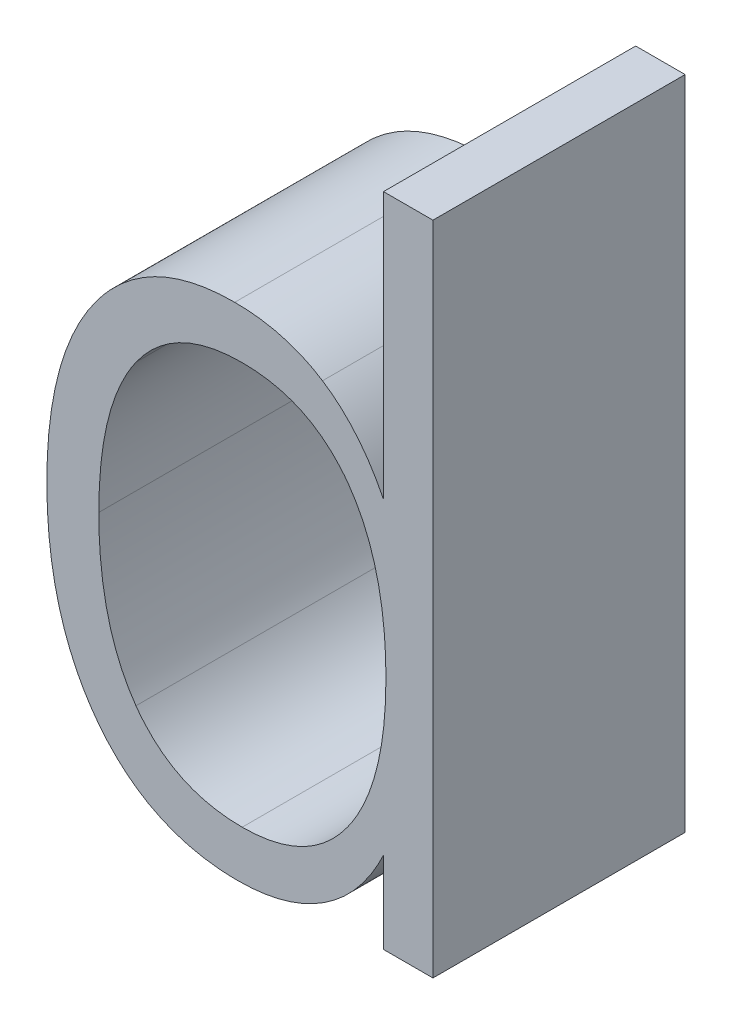
ISO-10303-21;
HEADER;
FILE_DESCRIPTION(('STEP AP214'),'2;1');
FILE_NAME('part.step','',(''),(''),'','','');
FILE_SCHEMA(('AUTOMOTIVE_DESIGN { 1 0 10303 214 1 1 1 1 }'));
ENDSEC;
DATA;
#1=APPLICATION_CONTEXT('core data for automotive mechanical design processes');
#2=APPLICATION_PROTOCOL_DEFINITION('international standard','automotive_design',2000,#1);
#3=PRODUCT_CONTEXT('',#1,'mechanical');
#4=PRODUCT('Part','Part','',(#3));
#5=PRODUCT_RELATED_PRODUCT_CATEGORY('part','',(#4));
#6=PRODUCT_DEFINITION_FORMATION('','',#4);
#7=PRODUCT_DEFINITION_CONTEXT('part definition',#1,'design');
#8=PRODUCT_DEFINITION('design','',#6,#7);
#9=PRODUCT_DEFINITION_SHAPE('','',#8);
#10=(LENGTH_UNIT() NAMED_UNIT(*) SI_UNIT(.MILLI.,.METRE.));
#11=(NAMED_UNIT(*) PLANE_ANGLE_UNIT() SI_UNIT($,.RADIAN.));
#12=(NAMED_UNIT(*) SI_UNIT($,.STERADIAN.) SOLID_ANGLE_UNIT());
#13=UNCERTAINTY_MEASURE_WITH_UNIT(LENGTH_MEASURE(1.E-05),#10,'distance_accuracy_value','');
#14=(GEOMETRIC_REPRESENTATION_CONTEXT(3) GLOBAL_UNCERTAINTY_ASSIGNED_CONTEXT((#13)) GLOBAL_UNIT_ASSIGNED_CONTEXT((#10,
#11,#12)) REPRESENTATION_CONTEXT('',''));
#15=CARTESIAN_POINT('',(0.,0.,0.));
#16=DIRECTION('',(0.,0.,1.));
#17=DIRECTION('',(1.,0.,0.));
#18=AXIS2_PLACEMENT_3D('',#15,#16,#17);
#19=CARTESIAN_POINT('',(-4.01548304044593,-5.20085865838051,-6.5));
#20=CARTESIAN_POINT('',(-4.01523138312723,-5.57735050779524,-6.5));
#21=CARTESIAN_POINT('',(-4.16731959833573,-5.78899684541117,-6.5));
#22=CARTESIAN_POINT('',(-4.01548304044593,-5.20085865838051,-5.5));
#23=CARTESIAN_POINT('',(-4.01523138312723,-5.57735050779524,-5.5));
#24=CARTESIAN_POINT('',(-4.16731959833573,-5.78899684541117,-5.50000000000001));
#25=(BOUNDED_SURFACE() B_SPLINE_SURFACE(1,2,((#19,#20,#21),(#22,#23,#24)),.UNSPECIFIED.,.F.,.F.,
.F.) B_SPLINE_SURFACE_WITH_KNOTS((2,2),(3,3),(-0.000531870954245445,-1.02265138938844E-06),
(5878.39466256072,5910.54595829486),
.UNSPECIFIED.) GEOMETRIC_REPRESENTATION_ITEM() RATIONAL_B_SPLINE_SURFACE(((0.992252686724051,
0.995349790952918,0.998516052379204),(0.992252686724051,0.995349790952918,0.998516052379204))) REPRESENTATION_ITEM('') SURFACE());
#26=DIRECTION('',(0.,0.,1.));
#27=VECTOR('',#26,1.);
#28=CARTESIAN_POINT('',(-4.015482624746,-5.202102016968,-6.5));
#29=LINE('',#28,#27);
#30=CARTESIAN_POINT('',(-4.015482624746,-5.202102016968,-6.5));
#31=VERTEX_POINT('',#30);
#32=CARTESIAN_POINT('',(-4.015482624746,-5.202102016968,-5.5));
#33=VERTEX_POINT('',#32);
#34=EDGE_CURVE('E211',#31,#33,#29,.T.);
#35=CARTESIAN_POINT('',(-1282.50872396695,1377.86818639547,-6.50000000000016));
#36=DIRECTION('',(0.,0.,-1.));
#37=DIRECTION('',(0.678554519954221,-0.734550041487778,0.));
#38=AXIS2_PLACEMENT_3D('',#35,#36,#37);
#39=ELLIPSE('',#38,1883.80194796684,33.0787545697085);
#40=CARTESIAN_POINT('',(-4.166736802523,-5.78818443919,-6.5));
#41=VERTEX_POINT('',#40);
#42=EDGE_CURVE('E252',#31,#41,#39,.T.);
#43=DIRECTION('',(0.,0.,1.));
#44=VECTOR('',#43,1.);
#45=CARTESIAN_POINT('',(-4.166736802523,-5.78818443919,-6.5));
#46=LINE('',#45,#44);
#47=CARTESIAN_POINT('',(-4.166736802523,-5.78818443919,-5.5));
#48=VERTEX_POINT('',#47);
#49=EDGE_CURVE('E11',#41,#48,#46,.T.);
#50=CARTESIAN_POINT('',(-1282.50872396695,1377.86818639547,-5.50000000000016));
#51=DIRECTION('',(0.,0.,-1.));
#52=DIRECTION('',(0.678554519954221,-0.734550041487778,0.));
#53=AXIS2_PLACEMENT_3D('',#50,#51,#52);
#54=ELLIPSE('',#53,1883.80194796684,33.0787545697085);
#55=EDGE_CURVE('E324',#33,#48,#54,.T.);
#56=ORIENTED_EDGE('',*,*,#34,.F.);
#57=ORIENTED_EDGE('',*,*,#42,.T.);
#58=ORIENTED_EDGE('',*,*,#49,.T.);
#59=ORIENTED_EDGE('',*,*,#55,.F.);
#60=EDGE_LOOP('',(#56,#57,#58,#59));
#61=FACE_BOUND('',#60,.T.);
#62=ADVANCED_FACE('F16',(#61),#25,.F.);
#63=CARTESIAN_POINT('',(-4.16608661975848,-5.78727566787338,-6.5));
#64=CARTESIAN_POINT('',(-4.23587521471325,-5.88500699006786,-6.49999999999999));
#65=CARTESIAN_POINT('',(-4.3307379461551,-5.9376015683592,-6.5));
#66=CARTESIAN_POINT('',(-4.44161468803858,-5.99907476645338,-6.5));
#67=CARTESIAN_POINT('',(-4.58663214113982,-5.99882847888092,-6.50000000000001));
#68=CARTESIAN_POINT('',(-4.16608661975848,-5.78727566787338,-5.5));
#69=CARTESIAN_POINT('',(-4.23587521471325,-5.88500699006786,-5.50000000000001));
#70=CARTESIAN_POINT('',(-4.3307379461551,-5.9376015683592,-5.5));
#71=CARTESIAN_POINT('',(-4.44161468803858,-5.99907476645338,-5.5));
#72=CARTESIAN_POINT('',(-4.58663214113982,-5.99882847888092,-5.5));
#73=(BOUNDED_SURFACE() B_SPLINE_SURFACE(1,2,((#63,#64,#65,#66,#67),(#68,#69,#70,#71,#72)),
.UNSPECIFIED.,.F.,.F.,.F.) B_SPLINE_SURFACE_WITH_KNOTS((2,2),(3,2,3),(-0.0076759980724137,
-1.63390557035084E-05),(406.092742618875,410.147846886676,414.882873821805),
.UNSPECIFIED.) GEOMETRIC_REPRESENTATION_ITEM() RATIONAL_B_SPLINE_SURFACE(((0.988645783398383,
0.99420836875953,1.,0.993237281186648,0.986786856156905),(0.988645783398383,0.99420836875953,1.,
0.993237281186648,0.986786856156905))) REPRESENTATION_ITEM('') SURFACE());
#74=CARTESIAN_POINT('',(-67.636341728998,108.244200299651,-6.5));
#75=DIRECTION('',(0.,0.,-1.));
#76=DIRECTION('',(0.484889288501053,-0.874575541561129,0.));
#77=AXIS2_PLACEMENT_3D('',#74,#75,#76);
#78=ELLIPSE('',#77,130.556820381336,7.7126504273919);
#79=CARTESIAN_POINT('',(-4.585475558079,-5.998829461412,-6.5));
#80=VERTEX_POINT('',#79);
#81=EDGE_CURVE('E194',#41,#80,#78,.T.);
#82=DIRECTION('',(0.,0.,1.));
#83=VECTOR('',#82,1.);
#84=CARTESIAN_POINT('',(-4.585475558079,-5.998829461412,-6.5));
#85=LINE('',#84,#83);
#86=CARTESIAN_POINT('',(-4.585475558079,-5.998829461412,-5.5));
#87=VERTEX_POINT('',#86);
#88=EDGE_CURVE('E29',#80,#87,#85,.T.);
#89=CARTESIAN_POINT('',(-67.636341728998,108.244200299651,-5.5));
#90=DIRECTION('',(0.,0.,-1.));
#91=DIRECTION('',(0.484889288501053,-0.874575541561129,0.));
#92=AXIS2_PLACEMENT_3D('',#89,#90,#91);
#93=ELLIPSE('',#92,130.556820381336,7.7126504273919);
#94=EDGE_CURVE('E328',#48,#87,#93,.T.);
#95=ORIENTED_EDGE('',*,*,#49,.F.);
#96=ORIENTED_EDGE('',*,*,#81,.T.);
#97=ORIENTED_EDGE('',*,*,#88,.T.);
#98=ORIENTED_EDGE('',*,*,#94,.F.);
#99=EDGE_LOOP('',(#95,#96,#97,#98));
#100=FACE_BOUND('',#99,.T.);
#101=ADVANCED_FACE('F18',(#100),#73,.F.);
#102=CARTESIAN_POINT('',(-4.58430355172886,-5.99882851911392,-6.50000000000001));
#103=CARTESIAN_POINT('',(-4.74752745931366,-5.99909085548459,-6.5));
#104=CARTESIAN_POINT('',(-4.8658298944141,-5.92631941079016,-6.5));
#105=CARTESIAN_POINT('',(-4.94723526236849,-5.87624448015247,-6.5));
#106=CARTESIAN_POINT('',(-5.00736801689359,-5.79158930997974,-6.5));
#107=CARTESIAN_POINT('',(-4.58430355172886,-5.99882851911392,-5.50000000000001));
#108=CARTESIAN_POINT('',(-4.74752745931366,-5.99909085548459,-5.5));
#109=CARTESIAN_POINT('',(-4.8658298944141,-5.92631941079016,-5.5));
#110=CARTESIAN_POINT('',(-4.94723526236849,-5.87624448015247,-5.5));
#111=CARTESIAN_POINT('',(-5.00736801689359,-5.79158930997974,-5.5));
#112=(BOUNDED_SURFACE() B_SPLINE_SURFACE(1,2,((#102,#103,#104,#105,#106),(#107,#108,#109,#110,
#111)),.UNSPECIFIED.,.F.,.F.,.F.) B_SPLINE_SURFACE_WITH_KNOTS((2,2),(3,2,3),
(-0.000275164440554266,-5.85322672658282E-07),(11413.7656468567,11441.4842535272,
11460.5662153827),
.UNSPECIFIED.) GEOMETRIC_REPRESENTATION_ITEM() RATIONAL_B_SPLINE_SURFACE(((0.997175452105519,
0.998580849870725,1.,0.99902303283293,0.9980525831595),(0.997175452105519,0.998580849870725,1.,
0.99902303283293,0.9980525831595))) REPRESENTATION_ITEM('') SURFACE());
#113=CARTESIAN_POINT('',(1903.26270009148,3096.06312561209,-6.49999999999977));
#114=DIRECTION('',(0.,0.,-1.));
#115=DIRECTION('',(-0.523940467335907,-0.851754886506577,0.));
#116=AXIS2_PLACEMENT_3D('',#113,#114,#115);
#117=ELLIPSE('',#116,3641.88042142783,40.481337390312);
#118=CARTESIAN_POINT('',(-5.006740202523,-5.792471394746,-6.5));
#119=VERTEX_POINT('',#118);
#120=EDGE_CURVE('E188',#80,#119,#117,.T.);
#121=DIRECTION('',(0.,0.,1.));
#122=VECTOR('',#121,1.);
#123=CARTESIAN_POINT('',(-5.006740202523,-5.792471394746,-6.5));
#124=LINE('',#123,#122);
#125=CARTESIAN_POINT('',(-5.006740202523,-5.792471394746,-5.5));
#126=VERTEX_POINT('',#125);
#127=EDGE_CURVE('E172',#119,#126,#124,.T.);
#128=CARTESIAN_POINT('',(1903.26270009148,3096.06312561209,-5.49999999999977));
#129=DIRECTION('',(0.,0.,-1.));
#130=DIRECTION('',(-0.523940467335907,-0.851754886506577,0.));
#131=AXIS2_PLACEMENT_3D('',#128,#129,#130);
#132=ELLIPSE('',#131,3641.88042142783,40.481337390312);
#133=EDGE_CURVE('E337',#87,#126,#132,.T.);
#134=ORIENTED_EDGE('',*,*,#88,.F.);
#135=ORIENTED_EDGE('',*,*,#120,.T.);
#136=ORIENTED_EDGE('',*,*,#127,.T.);
#137=ORIENTED_EDGE('',*,*,#133,.F.);
#138=EDGE_LOOP('',(#134,#135,#136,#137));
#139=FACE_BOUND('',#138,.T.);
#140=ADVANCED_FACE('F189',(#139),#112,.F.);
#141=CARTESIAN_POINT('',(-5.00615960424775,-5.79328526231746,-6.5));
#142=CARTESIAN_POINT('',(-5.1542078228253,-5.58613425978978,-6.5));
#143=CARTESIAN_POINT('',(-5.1540147960494,-5.20110169940371,-6.5));
#144=CARTESIAN_POINT('',(-5.00615960424775,-5.79328526231746,-5.5));
#145=CARTESIAN_POINT('',(-5.1542078228253,-5.58613425978978,-5.5));
#146=CARTESIAN_POINT('',(-5.1540147960494,-5.20110169940371,-5.5));
#147=(BOUNDED_SURFACE() B_SPLINE_SURFACE(1,2,((#141,#142,#143),(#144,#145,#146)),.UNSPECIFIED.,
.F.,.F.,.F.) B_SPLINE_SURFACE_WITH_KNOTS((2,2),(3,3),(-0.0146193626605001,
-2.87975745341014E-05),(217.082443067193,223.189260954368),
.UNSPECIFIED.) GEOMETRIC_REPRESENTATION_ITEM() RATIONAL_B_SPLINE_SURFACE(((0.990550005851137,
0.974480897501296,0.960296625814557),(0.990550005851137,0.974480897501296,0.960296625814557))) REPRESENTATION_ITEM('') SURFACE());
#148=CARTESIAN_POINT('',(38.6696992130983,47.000244300287,-6.5));
#149=DIRECTION('',(0.,0.,-1.));
#150=DIRECTION('',(-0.635867004474895,-0.771798647718512,0.));
#151=AXIS2_PLACEMENT_3D('',#148,#149,#150);
#152=ELLIPSE('',#151,68.5366245675646,5.97782293016551);
#153=CARTESIAN_POINT('',(-5.154015046968,-5.202102016968,-6.5));
#154=VERTEX_POINT('',#153);
#155=EDGE_CURVE('E177',#119,#154,#152,.T.);
#156=DIRECTION('',(0.,0.,1.));
#157=VECTOR('',#156,1.);
#158=CARTESIAN_POINT('',(-5.154015046968,-5.202102016968,-6.5));
#159=LINE('',#158,#157);
#160=CARTESIAN_POINT('',(-5.154015046968,-5.202102016968,-5.5));
#161=VERTEX_POINT('',#160);
#162=EDGE_CURVE('E185',#154,#161,#159,.T.);
#163=CARTESIAN_POINT('',(38.6696992130983,47.000244300287,-5.5));
#164=DIRECTION('',(0.,0.,-1.));
#165=DIRECTION('',(-0.635867004474895,-0.771798647718512,0.));
#166=AXIS2_PLACEMENT_3D('',#163,#164,#165);
#167=ELLIPSE('',#166,68.5366245675646,5.97782293016551);
#168=EDGE_CURVE('E180',#126,#161,#167,.T.);
#169=ORIENTED_EDGE('',*,*,#127,.F.);
#170=ORIENTED_EDGE('',*,*,#155,.T.);
#171=ORIENTED_EDGE('',*,*,#162,.T.);
#172=ORIENTED_EDGE('',*,*,#168,.F.);
#173=EDGE_LOOP('',(#169,#170,#171,#172));
#174=FACE_BOUND('',#173,.T.);
#175=ADVANCED_FACE('F174',(#174),#147,.F.);
#176=CARTESIAN_POINT('',(-5.154015046968,-5.202102016968,-5.49804208681511));
#177=CARTESIAN_POINT('',(-5.154015046968,-5.202102016968,-6.50195791318489));
#178=CARTESIAN_POINT('',(-5.154015046968,-4.94692232807889,-5.49804208681511));
#179=CARTESIAN_POINT('',(-5.154015046968,-4.94692232807889,-6.50195791318489));
#180=CARTESIAN_POINT('',(-5.104445535857,-4.750334794746,-5.49804208681511));
#181=CARTESIAN_POINT('',(-5.104445535857,-4.750334794746,-6.50195791318489));
#182=CARTESIAN_POINT('',(-5.005814513635,-4.611566128079,-5.49804208681511));
#183=CARTESIAN_POINT('',(-5.005814513635,-4.611566128079,-6.50195791318489));
#184=(BOUNDED_SURFACE() B_SPLINE_SURFACE(3,1,((#176,#177),(#178,#179),(#180,#181),(#182,#183)),
.UNSPECIFIED.,.F.,.F.,.F.) B_SPLINE_SURFACE_WITH_KNOTS((4,4),(2,2),(0.,1.),(-1.00195791318489,
0.00195791318489261),
.UNSPECIFIED.) GEOMETRIC_REPRESENTATION_ITEM() RATIONAL_B_SPLINE_SURFACE(((1.,1.),(1.,1.),(1.,
1.),(1.,1.))) REPRESENTATION_ITEM('') SURFACE());
#185=CARTESIAN_POINT('',(-5.154015046968,-5.202102016968,-6.5));
#186=CARTESIAN_POINT('',(-5.154015046968,-4.94692232807889,-6.5));
#187=CARTESIAN_POINT('',(-5.104445535857,-4.750334794746,-6.5));
#188=CARTESIAN_POINT('',(-5.005814513635,-4.611566128079,-6.5));
#189=(BOUNDED_CURVE() B_SPLINE_CURVE(3,(#185,#186,#187,#188),.UNSPECIFIED.,.F.,
.F.) B_SPLINE_CURVE_WITH_KNOTS((4,4),(0.,1.),
.UNSPECIFIED.) CURVE() GEOMETRIC_REPRESENTATION_ITEM() RATIONAL_B_SPLINE_CURVE((1.,1.,1.,1.)) REPRESENTATION_ITEM(''));
#190=CARTESIAN_POINT('',(-5.005814513635,-4.611566128079,-6.5));
#191=VERTEX_POINT('',#190);
#192=EDGE_CURVE('E201',#154,#191,#189,.T.);
#193=DIRECTION('',(0.,0.,1.));
#194=VECTOR('',#193,1.);
#195=CARTESIAN_POINT('',(-5.005814513635,-4.611566128079,-6.5));
#196=LINE('',#195,#194);
#197=CARTESIAN_POINT('',(-5.005814513635,-4.611566128079,-5.5));
#198=VERTEX_POINT('',#197);
#199=EDGE_CURVE('E288',#191,#198,#196,.T.);
#200=CARTESIAN_POINT('',(-5.154015046968,-5.202102016968,-5.5));
#201=CARTESIAN_POINT('',(-5.154015046968,-4.94692232807889,-5.5));
#202=CARTESIAN_POINT('',(-5.104445535857,-4.750334794746,-5.5));
#203=CARTESIAN_POINT('',(-5.005814513635,-4.611566128079,-5.5));
#204=(BOUNDED_CURVE() B_SPLINE_CURVE(3,(#200,#201,#202,#203),.UNSPECIFIED.,.F.,
.F.) B_SPLINE_CURVE_WITH_KNOTS((4,4),(0.,1.),
.UNSPECIFIED.) CURVE() GEOMETRIC_REPRESENTATION_ITEM() RATIONAL_B_SPLINE_CURVE((1.,1.,1.,1.)) REPRESENTATION_ITEM(''));
#205=EDGE_CURVE('E223',#161,#198,#204,.T.);
#206=ORIENTED_EDGE('',*,*,#162,.F.);
#207=ORIENTED_EDGE('',*,*,#192,.T.);
#208=ORIENTED_EDGE('',*,*,#199,.T.);
#209=ORIENTED_EDGE('',*,*,#205,.F.);
#210=EDGE_LOOP('',(#206,#207,#208,#209));
#211=FACE_BOUND('',#210,.T.);
#212=ADVANCED_FACE('F483',(#211),#184,.F.);
#213=CARTESIAN_POINT('',(-5.00645192637761,-4.61246255182292,-6.5));
#214=CARTESIAN_POINT('',(-4.94318164353439,-4.52330664374334,-6.5));
#215=CARTESIAN_POINT('',(-4.85724276799174,-4.47216449720199,-6.5));
#216=CARTESIAN_POINT('',(-4.74131704582077,-4.40317720555146,-6.5));
#217=CARTESIAN_POINT('',(-4.58429709329111,-4.40343667776477,-6.5));
#218=CARTESIAN_POINT('',(-5.00645192637761,-4.61246255182292,-5.50000000000001));
#219=CARTESIAN_POINT('',(-4.94318164353439,-4.52330664374334,-5.49999999999999));
#220=CARTESIAN_POINT('',(-4.85724276799174,-4.47216449720199,-5.5));
#221=CARTESIAN_POINT('',(-4.74131704582077,-4.40317720555146,-5.5));
#222=CARTESIAN_POINT('',(-4.58429709329111,-4.40343667776477,-5.5));
#223=(BOUNDED_SURFACE() B_SPLINE_SURFACE(1,2,((#213,#214,#215,#216,#217),(#218,#219,#220,#221,
#222)),.UNSPECIFIED.,.F.,.F.,.F.) B_SPLINE_SURFACE_WITH_KNOTS((2,2),(3,2,3),
(-0.00907406478935875,-1.93022431563862E-05),(690.456509755272,693.9094509789,698.557779111802),
.UNSPECIFIED.) GEOMETRIC_REPRESENTATION_ITEM() RATIONAL_B_SPLINE_SURFACE(((0.988572422331226,
0.994170172676361,1.,0.992151922490601,0.984724423653819),(0.988572422331226,0.994170172676361,
1.,0.992151922490601,0.984724423653819))) REPRESENTATION_ITEM('') SURFACE());
#224=CARTESIAN_POINT('',(51.6207196785017,-99.3772851299836,-6.5));
#225=DIRECTION('',(0.,0.,-1.));
#226=DIRECTION('',(0.51139573188262,-0.859345335364218,0.));
#227=AXIS2_PLACEMENT_3D('',#224,#225,#226);
#228=ELLIPSE('',#227,110.438861658924,7.0640011504587);
#229=CARTESIAN_POINT('',(-4.585472735857,-4.403435705857,-6.5));
#230=VERTEX_POINT('',#229);
#231=EDGE_CURVE('E208',#191,#230,#228,.T.);
#232=DIRECTION('',(0.,0.,1.));
#233=VECTOR('',#232,1.);
#234=CARTESIAN_POINT('',(-4.585472735857,-4.403435705857,-6.5));
#235=LINE('',#234,#233);
#236=CARTESIAN_POINT('',(-4.585472735857,-4.403435705857,-5.5));
#237=VERTEX_POINT('',#236);
#238=EDGE_CURVE('E43',#230,#237,#235,.T.);
#239=CARTESIAN_POINT('',(51.6207196785017,-99.3772851299836,-5.5));
#240=DIRECTION('',(0.,0.,-1.));
#241=DIRECTION('',(0.51139573188262,-0.859345335364218,0.));
#242=AXIS2_PLACEMENT_3D('',#239,#240,#241);
#243=ELLIPSE('',#242,110.438861658924,7.0640011504587);
#244=EDGE_CURVE('E218',#198,#237,#243,.T.);
#245=ORIENTED_EDGE('',*,*,#199,.F.);
#246=ORIENTED_EDGE('',*,*,#231,.T.);
#247=ORIENTED_EDGE('',*,*,#238,.T.);
#248=ORIENTED_EDGE('',*,*,#244,.F.);
#249=EDGE_LOOP('',(#245,#246,#247,#248));
#250=FACE_BOUND('',#249,.T.);
#251=ADVANCED_FACE('F476',(#250),#223,.F.);
#252=CARTESIAN_POINT('',(-4.585472735857,-4.403435705857,-5.49787270727539));
#253=CARTESIAN_POINT('',(-4.585472735857,-4.403435705857,-6.50212729272461));
#254=CARTESIAN_POINT('',(-4.402945513635,-4.403435705857,-5.49787270727539));
#255=CARTESIAN_POINT('',(-4.402945513635,-4.403435705857,-6.50212729272461));
#256=CARTESIAN_POINT('',(-4.262308535857,-4.472523705857,-5.49787270727539));
#257=CARTESIAN_POINT('',(-4.262308535857,-4.472523705857,-6.50212729272461));
#258=CARTESIAN_POINT('',(-4.163542046968,-4.610688416968,-5.49787270727539));
#259=CARTESIAN_POINT('',(-4.163542046968,-4.610688416968,-6.50212729272461));
#260=(BOUNDED_SURFACE() B_SPLINE_SURFACE(3,1,((#252,#253),(#254,#255),(#256,#257),(#258,#259)),
.UNSPECIFIED.,.F.,.F.,.F.) B_SPLINE_SURFACE_WITH_KNOTS((4,4),(2,2),(0.,1.),(-1.00212729272461,
0.00212729272461332),
.UNSPECIFIED.) GEOMETRIC_REPRESENTATION_ITEM() RATIONAL_B_SPLINE_SURFACE(((1.,1.),(1.,1.),(1.,
1.),(1.,1.))) REPRESENTATION_ITEM('') SURFACE());
#261=CARTESIAN_POINT('',(-4.585472735857,-4.403435705857,-6.5));
#262=CARTESIAN_POINT('',(-4.402945513635,-4.403435705857,-6.5));
#263=CARTESIAN_POINT('',(-4.262308535857,-4.472523705857,-6.5));
#264=CARTESIAN_POINT('',(-4.163542046968,-4.610688416968,-6.5));
#265=(BOUNDED_CURVE() B_SPLINE_CURVE(3,(#261,#262,#263,#264),.UNSPECIFIED.,.F.,
.F.) B_SPLINE_CURVE_WITH_KNOTS((4,4),(0.,1.),
.UNSPECIFIED.) CURVE() GEOMETRIC_REPRESENTATION_ITEM() RATIONAL_B_SPLINE_CURVE((1.,1.,1.,1.)) REPRESENTATION_ITEM(''));
#266=CARTESIAN_POINT('',(-4.163542046968,-4.610688416968,-6.5));
#267=VERTEX_POINT('',#266);
#268=EDGE_CURVE('E307',#230,#267,#265,.T.);
#269=DIRECTION('',(0.,0.,1.));
#270=VECTOR('',#269,1.);
#271=CARTESIAN_POINT('',(-4.163542046968,-4.610688416968,-6.5));
#272=LINE('',#271,#270);
#273=CARTESIAN_POINT('',(-4.163542046968,-4.610688416968,-5.5));
#274=VERTEX_POINT('',#273);
#275=EDGE_CURVE('E366',#267,#274,#272,.T.);
#276=CARTESIAN_POINT('',(-4.585472735857,-4.403435705857,-5.5));
#277=CARTESIAN_POINT('',(-4.402945513635,-4.403435705857,-5.5));
#278=CARTESIAN_POINT('',(-4.262308535857,-4.472523705857,-5.5));
#279=CARTESIAN_POINT('',(-4.163542046968,-4.610688416968,-5.5));
#280=(BOUNDED_CURVE() B_SPLINE_CURVE(3,(#276,#277,#278,#279),.UNSPECIFIED.,.F.,
.F.) B_SPLINE_CURVE_WITH_KNOTS((4,4),(0.,1.),
.UNSPECIFIED.) CURVE() GEOMETRIC_REPRESENTATION_ITEM() RATIONAL_B_SPLINE_CURVE((1.,1.,1.,1.)) REPRESENTATION_ITEM(''));
#281=EDGE_CURVE('E222',#237,#274,#280,.T.);
#282=ORIENTED_EDGE('',*,*,#238,.F.);
#283=ORIENTED_EDGE('',*,*,#268,.T.);
#284=ORIENTED_EDGE('',*,*,#275,.T.);
#285=ORIENTED_EDGE('',*,*,#281,.F.);
#286=EDGE_LOOP('',(#282,#283,#284,#285));
#287=FACE_BOUND('',#286,.T.);
#288=ADVANCED_FACE('F478',(#287),#260,.F.);
#289=CARTESIAN_POINT('',(-4.16412352107318,-4.60987517859366,-6.5));
#290=CARTESIAN_POINT('',(-4.01528893026234,-4.81765393365712,-6.5));
#291=CARTESIAN_POINT('',(-4.01548287652592,-5.2031023358901,-6.5));
#292=CARTESIAN_POINT('',(-4.16412352107318,-4.60987517859366,-5.50000000000001));
#293=CARTESIAN_POINT('',(-4.01528893026234,-4.81765393365712,-5.50000000000001));
#294=CARTESIAN_POINT('',(-4.01548287652592,-5.2031023358901,-5.50000000000001));
#295=(BOUNDED_SURFACE() B_SPLINE_SURFACE(1,2,((#289,#290,#291),(#292,#293,#294)),.UNSPECIFIED.,
.F.,.F.,.F.) B_SPLINE_SURFACE_WITH_KNOTS((2,2),(3,3),(-0.0213269388567497,
-4.17999819262334E-05),(1.45496702225575,6.49211185333003),
.UNSPECIFIED.) GEOMETRIC_REPRESENTATION_ITEM() RATIONAL_B_SPLINE_SURFACE(((0.988678573025146,
0.969475141017359,0.953000821335201),(0.988678573025146,0.969475141017359,0.953000821335201))) REPRESENTATION_ITEM('') SURFACE());
#296=CARTESIAN_POINT('',(-34.15522962294,-40.7500594527654,-6.5));
#297=DIRECTION('',(0.,0.,-1.));
#298=DIRECTION('',(-0.636319858389381,-0.77142532873851,0.));
#299=AXIS2_PLACEMENT_3D('',#296,#297,#298);
#300=ELLIPSE('',#299,46.9818608085529,4.96400063231897);
#301=EDGE_CURVE('E233',#267,#31,#300,.T.);
#302=CARTESIAN_POINT('',(-34.15522962294,-40.7500594527654,-5.5));
#303=DIRECTION('',(0.,0.,-1.));
#304=DIRECTION('',(-0.636319858389381,-0.77142532873851,0.));
#305=AXIS2_PLACEMENT_3D('',#302,#303,#304);
#306=ELLIPSE('',#305,46.9818608085529,4.96400063231897);
#307=EDGE_CURVE('E329',#274,#33,#306,.T.);
#308=ORIENTED_EDGE('',*,*,#275,.F.);
#309=ORIENTED_EDGE('',*,*,#301,.T.);
#310=ORIENTED_EDGE('',*,*,#34,.T.);
#311=ORIENTED_EDGE('',*,*,#307,.F.);
#312=EDGE_LOOP('',(#308,#309,#310,#311));
#313=FACE_BOUND('',#312,.T.);
#314=ADVANCED_FACE('F656',(#313),#295,.F.);
#315=CARTESIAN_POINT('',(-5.360014691412,-5.202102016968,-5.49850402368231));
#316=CARTESIAN_POINT('',(-5.360014691412,-5.202102016968,-6.50149597631769));
#317=CARTESIAN_POINT('',(-5.360014691412,-5.507723283634,-5.49850402368231));
#318=CARTESIAN_POINT('',(-5.360014691412,-5.507723283634,-6.50149597631769));
#319=CARTESIAN_POINT('',(-5.292267246968,-5.748693083634,-5.49850402368231));
#320=CARTESIAN_POINT('',(-5.292267246968,-5.748693083634,-6.50149597631769));
#321=CARTESIAN_POINT('',(-5.156800580301,-5.925604083634,-5.49850402368231));
#322=CARTESIAN_POINT('',(-5.156800580301,-5.925604083634,-6.50149597631769));
#323=(BOUNDED_SURFACE() B_SPLINE_SURFACE(3,1,((#315,#316),(#317,#318),(#319,#320),(#321,#322)),
.UNSPECIFIED.,.F.,.F.,.F.) B_SPLINE_SURFACE_WITH_KNOTS((4,4),(2,2),(0.,1.),(-1.00149597631769,
0.00149597631769287),
.UNSPECIFIED.) GEOMETRIC_REPRESENTATION_ITEM() RATIONAL_B_SPLINE_SURFACE(((1.,1.),(1.,1.),(1.,
1.),(1.,1.))) REPRESENTATION_ITEM('') SURFACE());
#324=DIRECTION('',(0.,0.,1.));
#325=VECTOR('',#324,1.);
#326=CARTESIAN_POINT('',(-5.360014691412,-5.202102016968,-6.5));
#327=LINE('',#326,#325);
#328=CARTESIAN_POINT('',(-5.360014691412,-5.202102016968,-6.5));
#329=VERTEX_POINT('',#328);
#330=CARTESIAN_POINT('',(-5.360014691412,-5.202102016968,-5.5));
#331=VERTEX_POINT('',#330);
#332=EDGE_CURVE('E276',#329,#331,#327,.T.);
#333=CARTESIAN_POINT('',(-5.360014691412,-5.202102016968,-6.5));
#334=CARTESIAN_POINT('',(-5.360014691412,-5.507723283634,-6.5));
#335=CARTESIAN_POINT('',(-5.292267246968,-5.748693083634,-6.5));
#336=CARTESIAN_POINT('',(-5.156800580301,-5.925604083634,-6.5));
#337=(BOUNDED_CURVE() B_SPLINE_CURVE(3,(#333,#334,#335,#336),.UNSPECIFIED.,.F.,
.F.) B_SPLINE_CURVE_WITH_KNOTS((4,4),(0.,1.),
.UNSPECIFIED.) CURVE() GEOMETRIC_REPRESENTATION_ITEM() RATIONAL_B_SPLINE_CURVE((1.,1.,1.,1.)) REPRESENTATION_ITEM(''));
#338=CARTESIAN_POINT('',(-5.156800580301,-5.925604083634,-6.5));
#339=VERTEX_POINT('',#338);
#340=EDGE_CURVE('E338',#329,#339,#337,.T.);
#341=DIRECTION('',(0.,0.,1.));
#342=VECTOR('',#341,1.);
#343=CARTESIAN_POINT('',(-5.156800580301,-5.925604083634,-6.5));
#344=LINE('',#343,#342);
#345=CARTESIAN_POINT('',(-5.156800580301,-5.925604083634,-5.5));
#346=VERTEX_POINT('',#345);
#347=EDGE_CURVE('E227',#339,#346,#344,.T.);
#348=CARTESIAN_POINT('',(-5.360014691412,-5.202102016968,-5.5));
#349=CARTESIAN_POINT('',(-5.360014691412,-5.507723283634,-5.5));
#350=CARTESIAN_POINT('',(-5.292267246968,-5.748693083634,-5.5));
#351=CARTESIAN_POINT('',(-5.156800580301,-5.925604083634,-5.5));
#352=(BOUNDED_CURVE() B_SPLINE_CURVE(3,(#348,#349,#350,#351),.UNSPECIFIED.,.F.,
.F.) B_SPLINE_CURVE_WITH_KNOTS((4,4),(0.,1.),
.UNSPECIFIED.) CURVE() GEOMETRIC_REPRESENTATION_ITEM() RATIONAL_B_SPLINE_CURVE((1.,1.,1.,1.)) REPRESENTATION_ITEM(''));
#353=EDGE_CURVE('E353',#331,#346,#352,.T.);
#354=ORIENTED_EDGE('',*,*,#332,.F.);
#355=ORIENTED_EDGE('',*,*,#340,.T.);
#356=ORIENTED_EDGE('',*,*,#347,.T.);
#357=ORIENTED_EDGE('',*,*,#353,.F.);
#358=EDGE_LOOP('',(#354,#355,#356,#357));
#359=FACE_BOUND('',#358,.T.);
#360=ADVANCED_FACE('F466',(#359),#323,.F.);
#361=CARTESIAN_POINT('',(-5.15951189538423,-4.4758598775147,-6.5));
#362=CARTESIAN_POINT('',(-5.36023264297963,-4.74172396833451,-6.5));
#363=CARTESIAN_POINT('',(-5.36001445484773,-5.20310226075456,-6.5));
#364=CARTESIAN_POINT('',(-5.15951189538423,-4.4758598775147,-5.50000000000001));
#365=CARTESIAN_POINT('',(-5.36023264297963,-4.74172396833451,-5.5));
#366=CARTESIAN_POINT('',(-5.36001445484773,-5.20310226075456,-5.5));
#367=(BOUNDED_SURFACE() B_SPLINE_SURFACE(1,2,((#361,#362,#363),(#364,#365,#366)),.UNSPECIFIED.,
.F.,.F.,.F.) B_SPLINE_SURFACE_WITH_KNOTS((2,2),(3,3),(-0.0106863216809216,
-1.60593213812971E-05),(295.657697529489,303.553883503893),
.UNSPECIFIED.) GEOMETRIC_REPRESENTATION_ITEM() RATIONAL_B_SPLINE_SURFACE(((0.995136178951472,
0.979689060521037,0.965927270304369),(0.995136178951472,0.979689060521037,0.965927270304369))) REPRESENTATION_ITEM('') SURFACE());
#368=DIRECTION('',(0.,0.,1.));
#369=VECTOR('',#368,1.);
#370=CARTESIAN_POINT('',(-5.16011386919,-4.476658261412,-6.5));
#371=LINE('',#370,#369);
#372=CARTESIAN_POINT('',(-5.16011386919,-4.476658261412,-6.5));
#373=VERTEX_POINT('',#372);
#374=CARTESIAN_POINT('',(-5.16011386919,-4.476658261412,-5.5));
#375=VERTEX_POINT('',#374);
#376=EDGE_CURVE('E224',#373,#375,#371,.T.);
#377=CARTESIAN_POINT('',(61.7752058446285,-70.0647103231382,-6.5));
#378=DIRECTION('',(0.,0.,1.));
#379=DIRECTION('',(-0.713494210188873,0.700661124957676,0.));
#380=AXIS2_PLACEMENT_3D('',#377,#378,#379);
#381=ELLIPSE('',#380,93.7196940118941,8.53319946071154);
#382=EDGE_CURVE('E247',#373,#329,#381,.T.);
#383=CARTESIAN_POINT('',(61.7752058446285,-70.0647103231382,-5.5));
#384=DIRECTION('',(0.,0.,1.));
#385=DIRECTION('',(-0.713494210188873,0.700661124957676,0.));
#386=AXIS2_PLACEMENT_3D('',#383,#384,#385);
#387=ELLIPSE('',#386,93.7196940118941,8.53319946071154);
#388=EDGE_CURVE('E385',#375,#331,#387,.T.);
#389=ORIENTED_EDGE('',*,*,#376,.F.);
#390=ORIENTED_EDGE('',*,*,#382,.T.);
#391=ORIENTED_EDGE('',*,*,#332,.T.);
#392=ORIENTED_EDGE('',*,*,#388,.F.);
#393=EDGE_LOOP('',(#389,#390,#391,#392));
#394=FACE_BOUND('',#393,.T.);
#395=ADVANCED_FACE('F462',(#394),#367,.F.);
#396=CARTESIAN_POINT('',(-5.15746813819001,-5.92473098466852,-6.5));
#397=CARTESIAN_POINT('',(-5.06848931064329,-6.04127193055033,-6.50000000000001));
#398=CARTESIAN_POINT('',(-4.95099061259097,-6.10682410477559,-6.5));
#399=CARTESIAN_POINT('',(-4.79967743703659,-6.19124127544162,-6.5));
#400=CARTESIAN_POINT('',(-4.60128683845031,-6.19099384972443,-6.50000000000001));
#401=CARTESIAN_POINT('',(-5.15746813819001,-5.92473098466852,-5.50000000000001));
#402=CARTESIAN_POINT('',(-5.06848931064329,-6.04127193055033,-5.5));
#403=CARTESIAN_POINT('',(-4.95099061259097,-6.10682410477559,-5.5));
#404=CARTESIAN_POINT('',(-4.79967743703659,-6.19124127544162,-5.5));
#405=CARTESIAN_POINT('',(-4.60128683845031,-6.19099384972443,-5.50000000000001));
#406=(BOUNDED_SURFACE() B_SPLINE_SURFACE(1,2,((#396,#397,#398,#399,#400),(#401,#402,#403,#404,
#405)),.UNSPECIFIED.,.F.,.F.,.F.) B_SPLINE_SURFACE_WITH_KNOTS((2,2),(3,2,3),
(-0.00816620767894416,-1.32631860751721E-05),(766.48587960001,770.664551031251,
776.035965748204),
.UNSPECIFIED.) GEOMETRIC_REPRESENTATION_ITEM() RATIONAL_B_SPLINE_SURFACE(((0.987570626745041,
0.993647536925256,1.,0.991834315233911,0.98412393911559),(0.987570626745041,0.993647536925256,
1.,0.991834315233911,0.98412393911559))) REPRESENTATION_ITEM('') SURFACE());
#407=CARTESIAN_POINT('',(54.8080233580023,101.007961021113,-6.5));
#408=DIRECTION('',(0.,0.,1.));
#409=DIRECTION('',(0.487204636008218,0.873287834938802,0.));
#410=AXIS2_PLACEMENT_3D('',#407,#408,#409);
#411=ELLIPSE('',#410,122.656907442093,8.71752956779585);
#412=CARTESIAN_POINT('',(-4.602445580301,-6.190994572523,-6.5));
#413=VERTEX_POINT('',#412);
#414=EDGE_CURVE('E322',#339,#413,#411,.T.);
#415=DIRECTION('',(0.,0.,1.));
#416=VECTOR('',#415,1.);
#417=CARTESIAN_POINT('',(-4.602445580301,-6.190994572523,-6.5));
#418=LINE('',#417,#416);
#419=CARTESIAN_POINT('',(-4.602445580301,-6.190994572523,-5.5));
#420=VERTEX_POINT('',#419);
#421=EDGE_CURVE('E228',#413,#420,#418,.T.);
#422=CARTESIAN_POINT('',(54.8080233580023,101.007961021113,-5.5));
#423=DIRECTION('',(0.,0.,1.));
#424=DIRECTION('',(0.487204636008218,0.873287834938802,0.));
#425=AXIS2_PLACEMENT_3D('',#422,#423,#424);
#426=ELLIPSE('',#425,122.656907442093,8.71752956779585);
#427=EDGE_CURVE('E217',#346,#420,#426,.T.);
#428=ORIENTED_EDGE('',*,*,#347,.F.);
#429=ORIENTED_EDGE('',*,*,#414,.T.);
#430=ORIENTED_EDGE('',*,*,#421,.T.);
#431=ORIENTED_EDGE('',*,*,#427,.F.);
#432=EDGE_LOOP('',(#428,#429,#430,#431));
#433=FACE_BOUND('',#432,.T.);
#434=ADVANCED_FACE('F543',(#433),#406,.F.);
#435=CARTESIAN_POINT('',(-4.615041158079,-4.211132305857,-5.49835046566148));
#436=CARTESIAN_POINT('',(-4.615041158079,-4.211132305857,-6.50164953433852));
#437=CARTESIAN_POINT('',(-4.844888580301,-4.211132305857,-5.49835046566148));
#438=CARTESIAN_POINT('',(-4.844888580301,-4.211132305857,-6.50164953433852));
#439=CARTESIAN_POINT('',(-5.026490113635,-4.299594861412,-5.49835046566148));
#440=CARTESIAN_POINT('',(-5.026490113635,-4.299594861412,-6.50164953433852));
#441=CARTESIAN_POINT('',(-5.16011386919,-4.476658261412,-5.49835046566148));
#442=CARTESIAN_POINT('',(-5.16011386919,-4.476658261412,-6.50164953433852));
#443=(BOUNDED_SURFACE() B_SPLINE_SURFACE(3,1,((#435,#436),(#437,#438),(#439,#440),(#441,#442)),
.UNSPECIFIED.,.F.,.F.,.F.) B_SPLINE_SURFACE_WITH_KNOTS((4,4),(2,2),(0.,1.),(-1.00164953433852,
0.00164953433852338),
.UNSPECIFIED.) GEOMETRIC_REPRESENTATION_ITEM() RATIONAL_B_SPLINE_SURFACE(((1.,1.),(1.,1.),(1.,
1.),(1.,1.))) REPRESENTATION_ITEM('') SURFACE());
#444=DIRECTION('',(0.,0.,1.));
#445=VECTOR('',#444,1.);
#446=CARTESIAN_POINT('',(-4.615041158079,-4.211132305857,-6.5));
#447=LINE('',#446,#445);
#448=CARTESIAN_POINT('',(-4.615041158079,-4.211132305857,-6.5));
#449=VERTEX_POINT('',#448);
#450=CARTESIAN_POINT('',(-4.615041158079,-4.211132305857,-5.5));
#451=VERTEX_POINT('',#450);
#452=EDGE_CURVE('E315',#449,#451,#447,.T.);
#453=CARTESIAN_POINT('',(-4.615041158079,-4.211132305857,-6.5));
#454=CARTESIAN_POINT('',(-4.844888580301,-4.211132305857,-6.5));
#455=CARTESIAN_POINT('',(-5.026490113635,-4.299594861412,-6.5));
#456=CARTESIAN_POINT('',(-5.16011386919,-4.476658261412,-6.5));
#457=(BOUNDED_CURVE() B_SPLINE_CURVE(3,(#453,#454,#455,#456),.UNSPECIFIED.,.F.,
.F.) B_SPLINE_CURVE_WITH_KNOTS((4,4),(0.,1.),
.UNSPECIFIED.) CURVE() GEOMETRIC_REPRESENTATION_ITEM() RATIONAL_B_SPLINE_CURVE((1.,1.,1.,1.)) REPRESENTATION_ITEM(''));
#458=EDGE_CURVE('E240',#449,#373,#457,.T.);
#459=CARTESIAN_POINT('',(-4.615041158079,-4.211132305857,-5.5));
#460=CARTESIAN_POINT('',(-4.844888580301,-4.211132305857,-5.5));
#461=CARTESIAN_POINT('',(-5.026490113635,-4.299594861412,-5.5));
#462=CARTESIAN_POINT('',(-5.16011386919,-4.476658261412,-5.5));
#463=(BOUNDED_CURVE() B_SPLINE_CURVE(3,(#459,#460,#461,#462),.UNSPECIFIED.,.F.,
.F.) B_SPLINE_CURVE_WITH_KNOTS((4,4),(0.,1.),
.UNSPECIFIED.) CURVE() GEOMETRIC_REPRESENTATION_ITEM() RATIONAL_B_SPLINE_CURVE((1.,1.,1.,1.)) REPRESENTATION_ITEM(''));
#464=EDGE_CURVE('E379',#451,#375,#463,.T.);
#465=ORIENTED_EDGE('',*,*,#452,.F.);
#466=ORIENTED_EDGE('',*,*,#458,.T.);
#467=ORIENTED_EDGE('',*,*,#376,.T.);
#468=ORIENTED_EDGE('',*,*,#464,.F.);
#469=EDGE_LOOP('',(#465,#466,#467,#468));
#470=FACE_BOUND('',#469,.T.);
#471=ADVANCED_FACE('F538',(#470),#443,.F.);
#472=CARTESIAN_POINT('',(-4.60344592806538,-6.19099393334437,-6.5));
#473=CARTESIAN_POINT('',(-4.44816390525838,-6.19119219918604,-6.5));
#474=CARTESIAN_POINT('',(-4.32219129325832,-6.12999250321924,-6.5));
#475=CARTESIAN_POINT('',(-4.28977725804477,-6.11424519855809,-6.5));
#476=CARTESIAN_POINT('',(-4.25934177382685,-6.09444349253692,-6.50000000000001));
#477=CARTESIAN_POINT('',(-4.60344592806538,-6.19099393334437,-5.50000000000001));
#478=CARTESIAN_POINT('',(-4.44816390525838,-6.19119219918604,-5.5));
#479=CARTESIAN_POINT('',(-4.32219129325832,-6.12999250321924,-5.5));
#480=CARTESIAN_POINT('',(-4.28977725804477,-6.11424519855809,-5.5));
#481=CARTESIAN_POINT('',(-4.25934177382685,-6.09444349253692,-5.50000000000001));
#482=(BOUNDED_SURFACE() B_SPLINE_SURFACE(1,2,((#472,#473,#474,#475,#476),(#477,#478,#479,#480,
#481)),.UNSPECIFIED.,.F.,.F.,.F.) B_SPLINE_SURFACE_WITH_KNOTS((2,2),(3,2,3),
(-0.0491137996482835,-0.000139271207144645),(126.472869662831,128.294962854643,
128.769672296503),
.UNSPECIFIED.) GEOMETRIC_REPRESENTATION_ITEM() RATIONAL_B_SPLINE_SURFACE(((0.968612284938395,
0.983360882514695,1.,0.995665015263768,0.991458350962808),(0.968612284938395,0.983360882514695,
1.,0.995665015263768,0.991458350962808))) REPRESENTATION_ITEM('') SURFACE());
#483=CARTESIAN_POINT('',(-13.2453876288657,12.2373413696154,-6.5));
#484=DIRECTION('',(0.,0.,1.));
#485=DIRECTION('',(-0.436980061531217,0.899471192325899,0.));
#486=AXIS2_PLACEMENT_3D('',#483,#484,#485);
#487=ELLIPSE('',#486,20.4201465864208,3.42854612880678);
#488=CARTESIAN_POINT('',(-4.260180580301,-6.094988216968,-6.5));
#489=VERTEX_POINT('',#488);
#490=EDGE_CURVE('E319',#413,#489,#487,.T.);
#491=DIRECTION('',(0.,0.,1.));
#492=VECTOR('',#491,1.);
#493=CARTESIAN_POINT('',(-4.260180580301,-6.094988216968,-6.5));
#494=LINE('',#493,#492);
#495=CARTESIAN_POINT('',(-4.260180580301,-6.094988216968,-5.5));
#496=VERTEX_POINT('',#495);
#497=EDGE_CURVE('E281',#489,#496,#494,.T.);
#498=CARTESIAN_POINT('',(-13.2453876288657,12.2373413696154,-5.5));
#499=DIRECTION('',(0.,0.,1.));
#500=DIRECTION('',(-0.436980061531217,0.899471192325899,0.));
#501=AXIS2_PLACEMENT_3D('',#498,#499,#500);
#502=ELLIPSE('',#501,20.4201465864208,3.42854612880678);
#503=EDGE_CURVE('E213',#420,#496,#502,.T.);
#504=ORIENTED_EDGE('',*,*,#421,.F.);
#505=ORIENTED_EDGE('',*,*,#490,.T.);
#506=ORIENTED_EDGE('',*,*,#497,.T.);
#507=ORIENTED_EDGE('',*,*,#503,.F.);
#508=EDGE_LOOP('',(#504,#505,#506,#507));
#509=FACE_BOUND('',#508,.T.);
#510=ADVANCED_FACE('F547',(#509),#482,.F.);
#511=CARTESIAN_POINT('',(-4.26610085934585,-4.3070932051427,-6.50000000000001));
#512=CARTESIAN_POINT('',(-4.28102389645109,-4.29739087510413,-6.5));
#513=CARTESIAN_POINT('',(-4.29649977821652,-4.28866869195666,-6.5));
#514=CARTESIAN_POINT('',(-4.43445401502315,-4.2109178963875,-6.5));
#515=CARTESIAN_POINT('',(-4.61604151784216,-4.21113289825572,-6.5));
#516=CARTESIAN_POINT('',(-4.26610085934585,-4.3070932051427,-5.50000000000001));
#517=CARTESIAN_POINT('',(-4.28102389645109,-4.29739087510413,-5.5));
#518=CARTESIAN_POINT('',(-4.29649977821652,-4.28866869195666,-5.5));
#519=CARTESIAN_POINT('',(-4.43445401502315,-4.2109178963875,-5.5));
#520=CARTESIAN_POINT('',(-4.61604151784216,-4.21113289825572,-5.5));
#521=(BOUNDED_SURFACE() B_SPLINE_SURFACE(1,2,((#511,#512,#513,#514,#515),(#516,#517,#518,#519,
#520)),.UNSPECIFIED.,.F.,.F.,.F.) B_SPLINE_SURFACE_WITH_KNOTS((2,2),(3,2,3),
(-0.0190273580487783,-5.40373409096441E-05),(165.197452311372,165.579484053464,
168.948929159465),
.UNSPECIFIED.) GEOMETRIC_REPRESENTATION_ITEM() RATIONAL_B_SPLINE_SURFACE(((0.997309372664759,
0.998648449628043,1.,0.988079590556121,0.977129474394451),(0.997309372664759,0.998648449628043,
1.,0.988079590556121,0.977129474394451))) REPRESENTATION_ITEM('') SURFACE());
#522=DIRECTION('',(0.,0.,1.));
#523=VECTOR('',#522,1.);
#524=CARTESIAN_POINT('',(-4.266939802523,-4.306548816968,-6.5));
#525=LINE('',#524,#523);
#526=CARTESIAN_POINT('',(-4.266939802523,-4.306548816968,-6.5));
#527=VERTEX_POINT('',#526);
#528=CARTESIAN_POINT('',(-4.266939802523,-4.306548816968,-5.5));
#529=VERTEX_POINT('',#528);
#530=EDGE_CURVE('E278',#527,#529,#525,.T.);
#531=CARTESIAN_POINT('',(-30.1746924141323,-50.2046908932656,-6.5));
#532=DIRECTION('',(0.,0.,1.));
#533=DIRECTION('',(0.490987905353774,0.87116638869754,0.));
#534=AXIS2_PLACEMENT_3D('',#531,#532,#533);
#535=ELLIPSE('',#534,52.7063748409191,5.43703703818101);
#536=EDGE_CURVE('E246',#527,#449,#535,.T.);
#537=CARTESIAN_POINT('',(-30.1746924141323,-50.2046908932656,-5.5));
#538=DIRECTION('',(0.,0.,1.));
#539=DIRECTION('',(0.490987905353774,0.87116638869754,0.));
#540=AXIS2_PLACEMENT_3D('',#537,#538,#539);
#541=ELLIPSE('',#540,52.7063748409191,5.43703703818101);
#542=EDGE_CURVE('E311',#529,#451,#541,.T.);
#543=ORIENTED_EDGE('',*,*,#530,.F.);
#544=ORIENTED_EDGE('',*,*,#536,.T.);
#545=ORIENTED_EDGE('',*,*,#452,.T.);
#546=ORIENTED_EDGE('',*,*,#542,.F.);
#547=EDGE_LOOP('',(#543,#544,#545,#546));
#548=FACE_BOUND('',#547,.T.);
#549=ADVANCED_FACE('F535',(#548),#521,.F.);
#550=CARTESIAN_POINT('',(-4.26101948722168,-6.09553256777677,-6.5));
#551=CARTESIAN_POINT('',(-4.25273181383495,-6.09016494417389,-6.5));
#552=CARTESIAN_POINT('',(-4.24463536884496,-6.08452289037914,-6.5));
#553=CARTESIAN_POINT('',(-4.10702911435446,-5.98863118836817,-6.5));
#554=CARTESIAN_POINT('',(-4.02468905853212,-5.81350088522775,-6.5));
#555=CARTESIAN_POINT('',(-4.26101948722168,-6.09553256777677,-5.50000000000001));
#556=CARTESIAN_POINT('',(-4.25273181383495,-6.09016494417389,-5.50000000000001));
#557=CARTESIAN_POINT('',(-4.24463536884496,-6.08452289037914,-5.5));
#558=CARTESIAN_POINT('',(-4.10702911435446,-5.98863118836817,-5.5));
#559=CARTESIAN_POINT('',(-4.02468905853212,-5.81350088522775,-5.5));
#560=(BOUNDED_SURFACE() B_SPLINE_SURFACE(1,2,((#550,#551,#552,#553,#554),(#555,#556,#557,#558,
#559)),.UNSPECIFIED.,.F.,.F.,.F.) B_SPLINE_SURFACE_WITH_KNOTS((2,2),(3,2,3),
(-0.00245399152046394,-6.92537533261706E-06),(2567.05956838314,2567.64015949491,
2577.46618156788),
.UNSPECIFIED.) GEOMETRIC_REPRESENTATION_ITEM() RATIONAL_B_SPLINE_SURFACE(((0.999470650458621,
0.999735085621072,1.,0.995516544290771,0.991170349356496),(0.999470650458621,0.999735085621072,
1.,0.995516544290771,0.991170349356496))) REPRESENTATION_ITEM('') SURFACE());
#561=CARTESIAN_POINT('',(-237.883394479924,329.191147903998,-6.5));
#562=DIRECTION('',(0.,0.,1.));
#563=DIRECTION('',(-0.571729705556115,0.820442041697473,0.));
#564=AXIS2_PLACEMENT_3D('',#561,#562,#563);
#565=ELLIPSE('',#564,408.652474831106,15.4258854226976);
#566=CARTESIAN_POINT('',(-4.02516566919,-5.814512950301,-6.5));
#567=VERTEX_POINT('',#566);
#568=EDGE_CURVE('E22',#489,#567,#565,.T.);
#569=DIRECTION('',(0.,0.,1.));
#570=VECTOR('',#569,1.);
#571=CARTESIAN_POINT('',(-4.02516566919,-5.814512950301,-6.5));
#572=LINE('',#571,#570);
#573=CARTESIAN_POINT('',(-4.02516566919,-5.814512950301,-5.5));
#574=VERTEX_POINT('',#573);
#575=EDGE_CURVE('E282',#567,#574,#572,.T.);
#576=CARTESIAN_POINT('',(-237.883394479924,329.191147903998,-5.5));
#577=DIRECTION('',(0.,0.,1.));
#578=DIRECTION('',(-0.571729705556115,0.820442041697473,0.));
#579=AXIS2_PLACEMENT_3D('',#576,#577,#578);
#580=ELLIPSE('',#579,408.652474831106,15.4258854226976);
#581=EDGE_CURVE('E216',#496,#574,#580,.T.);
#582=ORIENTED_EDGE('',*,*,#497,.F.);
#583=ORIENTED_EDGE('',*,*,#568,.T.);
#584=ORIENTED_EDGE('',*,*,#575,.T.);
#585=ORIENTED_EDGE('',*,*,#581,.F.);
#586=EDGE_LOOP('',(#582,#583,#584,#585));
#587=FACE_BOUND('',#586,.T.);
#588=ADVANCED_FACE('F550',(#587),#560,.F.);
#589=CARTESIAN_POINT('',(-4.02465825681345,-4.59395676980109,-6.5));
#590=CARTESIAN_POINT('',(-4.11935401055203,-4.40224835514349,-6.50000000000001));
#591=CARTESIAN_POINT('',(-4.26777829829848,-4.30600406126667,-6.5));
#592=CARTESIAN_POINT('',(-4.02465825681345,-4.59395676980109,-5.50000000000001));
#593=CARTESIAN_POINT('',(-4.11935401055203,-4.40224835514349,-5.5));
#594=CARTESIAN_POINT('',(-4.26777829829848,-4.30600406126667,-5.5));
#595=(BOUNDED_SURFACE() B_SPLINE_SURFACE(1,2,((#589,#590,#591),(#592,#593,#594)),.UNSPECIFIED.,
.F.,.F.,.F.) B_SPLINE_SURFACE_WITH_KNOTS((2,2),(3,3),(-0.00894347611194367,
-2.54356404724224E-05),(346.254154414307,351.701103724167),
.UNSPECIFIED.) GEOMETRIC_REPRESENTATION_ITEM() RATIONAL_B_SPLINE_SURFACE(((0.980664167548597,
0.989102638087287,0.998101311204689),(0.980664167548597,0.989102638087287,0.998101311204689))) REPRESENTATION_ITEM('') SURFACE());
#596=DIRECTION('',(0.,0.,1.));
#597=VECTOR('',#596,1.);
#598=CARTESIAN_POINT('',(-4.02516566919,-4.592930994746,-6.5));
#599=LINE('',#598,#597);
#600=CARTESIAN_POINT('',(-4.02516566919,-4.592930994746,-6.5));
#601=VERTEX_POINT('',#600);
#602=CARTESIAN_POINT('',(-4.02516566919,-4.592930994746,-5.5));
#603=VERTEX_POINT('',#602);
#604=EDGE_CURVE('E330',#601,#603,#599,.T.);
#605=CARTESIAN_POINT('',(-59.1135087755138,-102.11517112346,-6.5));
#606=DIRECTION('',(0.,0.,1.));
#607=DIRECTION('',(0.48881020592615,0.872390155023792,0.));
#608=AXIS2_PLACEMENT_3D('',#605,#606,#607);
#609=ELLIPSE('',#608,112.13809522369,7.98519592878634);
#610=EDGE_CURVE('E234',#601,#527,#609,.T.);
#611=CARTESIAN_POINT('',(-59.1135087755138,-102.11517112346,-5.5));
#612=DIRECTION('',(0.,0.,1.));
#613=DIRECTION('',(0.48881020592615,0.872390155023792,0.));
#614=AXIS2_PLACEMENT_3D('',#611,#612,#613);
#615=ELLIPSE('',#614,112.13809522369,7.98519592878634);
#616=EDGE_CURVE('E272',#603,#529,#615,.T.);
#617=ORIENTED_EDGE('',*,*,#604,.F.);
#618=ORIENTED_EDGE('',*,*,#610,.T.);
#619=ORIENTED_EDGE('',*,*,#530,.T.);
#620=ORIENTED_EDGE('',*,*,#616,.F.);
#621=EDGE_LOOP('',(#617,#618,#619,#620));
#622=FACE_BOUND('',#621,.T.);
#623=ADVANCED_FACE('F530',(#622),#595,.F.);
#624=CARTESIAN_POINT('',(-4.02516566919,-5.9764958058565,-5.49));
#625=DIRECTION('',(1.,0.,0.));
#626=DIRECTION('',(0.,0.,-1.));
#627=AXIS2_PLACEMENT_3D('',#624,#625,#626);
#628=PLANE('',#627);
#629=ORIENTED_EDGE('',*,*,#575,.F.);
#630=DIRECTION('',(0.,-1.,0.));
#631=VECTOR('',#630,1.);
#632=CARTESIAN_POINT('',(-4.02516566919,-5.814512950301,-6.5));
#633=LINE('',#632,#631);
#634=CARTESIAN_POINT('',(-4.02516566919,-6.138478661412,-6.5));
#635=VERTEX_POINT('',#634);
#636=EDGE_CURVE('E378',#567,#635,#633,.T.);
#637=ORIENTED_EDGE('',*,*,#636,.T.);
#638=DIRECTION('',(0.,0.,1.));
#639=VECTOR('',#638,1.);
#640=CARTESIAN_POINT('',(-4.02516566919,-6.138478661412,-6.5));
#641=LINE('',#640,#639);
#642=CARTESIAN_POINT('',(-4.02516566919,-6.138478661412,-5.5));
#643=VERTEX_POINT('',#642);
#644=EDGE_CURVE('E333',#635,#643,#641,.T.);
#645=ORIENTED_EDGE('',*,*,#644,.T.);
#646=DIRECTION('',(0.,-1.,0.));
#647=VECTOR('',#646,1.);
#648=CARTESIAN_POINT('',(-4.02516566919,-5.814512950301,-5.5));
#649=LINE('',#648,#647);
#650=EDGE_CURVE('E357',#574,#643,#649,.T.);
#651=ORIENTED_EDGE('',*,*,#650,.F.);
#652=EDGE_LOOP('',(#629,#637,#645,#651));
#653=FACE_BOUND('',#652,.T.);
#654=ADVANCED_FACE('F553',(#653),#628,.F.);
#655=CARTESIAN_POINT('',(-4.02516566919,-4.0645305614125,-5.49));
#656=DIRECTION('',(1.,0.,0.));
#657=DIRECTION('',(0.,0.,-1.));
#658=AXIS2_PLACEMENT_3D('',#655,#656,#657);
#659=PLANE('',#658);
#660=DIRECTION('',(0.,0.,1.));
#661=VECTOR('',#660,1.);
#662=CARTESIAN_POINT('',(-4.02516566919,-3.536130128079,-6.5));
#663=LINE('',#662,#661);
#664=CARTESIAN_POINT('',(-4.02516566919,-3.536130128079,-6.5));
#665=VERTEX_POINT('',#664);
#666=CARTESIAN_POINT('',(-4.02516566919,-3.536130128079,-5.5));
#667=VERTEX_POINT('',#666);
#668=EDGE_CURVE('E303',#665,#667,#663,.T.);
#669=ORIENTED_EDGE('',*,*,#668,.F.);
#670=DIRECTION('',(0.,-1.,0.));
#671=VECTOR('',#670,1.);
#672=CARTESIAN_POINT('',(-4.02516566919,-3.536130128079,-6.5));
#673=LINE('',#672,#671);
#674=EDGE_CURVE('E229',#665,#601,#673,.T.);
#675=ORIENTED_EDGE('',*,*,#674,.T.);
#676=ORIENTED_EDGE('',*,*,#604,.T.);
#677=DIRECTION('',(0.,-1.,0.));
#678=VECTOR('',#677,1.);
#679=CARTESIAN_POINT('',(-4.02516566919,-3.536130128079,-5.5));
#680=LINE('',#679,#678);
#681=EDGE_CURVE('E262',#667,#603,#680,.T.);
#682=ORIENTED_EDGE('',*,*,#681,.F.);
#683=EDGE_LOOP('',(#669,#675,#676,#682));
#684=FACE_BOUND('',#683,.T.);
#685=ADVANCED_FACE('F525',(#684),#659,.F.);
#686=CARTESIAN_POINT('',(-3.92713436919,-6.138478661412,-5.49));
#687=DIRECTION('',(0.,1.,0.));
#688=DIRECTION('',(-1.,0.,0.));
#689=AXIS2_PLACEMENT_3D('',#686,#687,#688);
#690=PLANE('',#689);
#691=ORIENTED_EDGE('',*,*,#644,.F.);
#692=DIRECTION('',(1.,0.,0.));
#693=VECTOR('',#692,1.);
#694=CARTESIAN_POINT('',(-4.02516566919,-6.138478661412,-6.5));
#695=LINE('',#694,#693);
#696=CARTESIAN_POINT('',(-3.82910306919,-6.13847834790818,-6.5));
#697=VERTEX_POINT('',#696);
#698=EDGE_CURVE('E302',#635,#697,#695,.T.);
#699=ORIENTED_EDGE('',*,*,#698,.T.);
#700=DIRECTION('',(0.,0.,1.));
#701=VECTOR('',#700,1.);
#702=CARTESIAN_POINT('',(-3.82910306919,-6.138478661412,-5.49));
#703=LINE('',#702,#701);
#704=CARTESIAN_POINT('',(-3.82910306919,-6.13847834790834,-5.5));
#705=VERTEX_POINT('',#704);
#706=EDGE_CURVE('E235',#697,#705,#703,.T.);
#707=ORIENTED_EDGE('',*,*,#706,.T.);
#708=DIRECTION('',(1.,0.,0.));
#709=VECTOR('',#708,1.);
#710=CARTESIAN_POINT('',(-4.02516566919,-6.138478661412,-5.5));
#711=LINE('',#710,#709);
#712=EDGE_CURVE('E360',#643,#705,#711,.T.);
#713=ORIENTED_EDGE('',*,*,#712,.F.);
#714=EDGE_LOOP('',(#691,#699,#707,#713));
#715=FACE_BOUND('',#714,.T.);
#716=ADVANCED_FACE('F495',(#715),#690,.F.);
#717=CARTESIAN_POINT('',(-4.367934945647,-4.96762245089956,-5.5));
#718=DIRECTION('',(0.,0.,1.));
#719=DIRECTION('',(0.,-1.,0.));
#720=AXIS2_PLACEMENT_3D('',#717,#718,#719);
#721=PLANE('',#720);
#722=ORIENTED_EDGE('',*,*,#307,.T.);
#723=ORIENTED_EDGE('',*,*,#55,.T.);
#724=ORIENTED_EDGE('',*,*,#94,.T.);
#725=ORIENTED_EDGE('',*,*,#133,.T.);
#726=ORIENTED_EDGE('',*,*,#168,.T.);
#727=ORIENTED_EDGE('',*,*,#205,.T.);
#728=ORIENTED_EDGE('',*,*,#244,.T.);
#729=ORIENTED_EDGE('',*,*,#281,.T.);
#730=EDGE_LOOP('',(#722,#723,#724,#725,#726,#727,#728,#729));
#731=FACE_BOUND('',#730,.T.);
#732=DIRECTION('',(0.,1.,0.));
#733=VECTOR('',#732,1.);
#734=CARTESIAN_POINT('',(-3.82910306919,-6.13847583919,-5.5));
#735=LINE('',#734,#733);
#736=CARTESIAN_POINT('',(-3.82910306919,-3.536130128079,-5.5));
#737=VERTEX_POINT('',#736);
#738=EDGE_CURVE('E293',#705,#737,#735,.T.);
#739=ORIENTED_EDGE('',*,*,#738,.T.);
#740=DIRECTION('',(-1.,0.,0.));
#741=VECTOR('',#740,1.);
#742=CARTESIAN_POINT('',(-3.82910306919,-3.536130128079,-5.5));
#743=LINE('',#742,#741);
#744=EDGE_CURVE('E298',#737,#667,#743,.T.);
#745=ORIENTED_EDGE('',*,*,#744,.T.);
#746=ORIENTED_EDGE('',*,*,#681,.T.);
#747=ORIENTED_EDGE('',*,*,#616,.T.);
#748=ORIENTED_EDGE('',*,*,#542,.T.);
#749=ORIENTED_EDGE('',*,*,#464,.T.);
#750=ORIENTED_EDGE('',*,*,#388,.T.);
#751=ORIENTED_EDGE('',*,*,#353,.T.);
#752=ORIENTED_EDGE('',*,*,#427,.T.);
#753=ORIENTED_EDGE('',*,*,#503,.T.);
#754=ORIENTED_EDGE('',*,*,#581,.T.);
#755=ORIENTED_EDGE('',*,*,#650,.T.);
#756=ORIENTED_EDGE('',*,*,#712,.T.);
#757=EDGE_LOOP('',(#739,#745,#746,#747,#748,#749,#750,#751,#752,#753,#754,#755,#756));
#758=FACE_BOUND('',#757,.T.);
#759=ADVANCED_FACE('F468',(#731,#758),#721,.T.);
#760=CARTESIAN_POINT('',(-4.367934945647,-4.96762245089956,-6.5));
#761=DIRECTION('',(0.,0.,1.));
#762=DIRECTION('',(0.,-1.,0.));
#763=AXIS2_PLACEMENT_3D('',#760,#761,#762);
#764=PLANE('',#763);
#765=ORIENTED_EDGE('',*,*,#301,.F.);
#766=ORIENTED_EDGE('',*,*,#268,.F.);
#767=ORIENTED_EDGE('',*,*,#231,.F.);
#768=ORIENTED_EDGE('',*,*,#192,.F.);
#769=ORIENTED_EDGE('',*,*,#155,.F.);
#770=ORIENTED_EDGE('',*,*,#120,.F.);
#771=ORIENTED_EDGE('',*,*,#81,.F.);
#772=ORIENTED_EDGE('',*,*,#42,.F.);
#773=EDGE_LOOP('',(#765,#766,#767,#768,#769,#770,#771,#772));
#774=FACE_BOUND('',#773,.T.);
#775=ORIENTED_EDGE('',*,*,#698,.F.);
#776=ORIENTED_EDGE('',*,*,#636,.F.);
#777=ORIENTED_EDGE('',*,*,#568,.F.);
#778=ORIENTED_EDGE('',*,*,#490,.F.);
#779=ORIENTED_EDGE('',*,*,#414,.F.);
#780=ORIENTED_EDGE('',*,*,#340,.F.);
#781=ORIENTED_EDGE('',*,*,#382,.F.);
#782=ORIENTED_EDGE('',*,*,#458,.F.);
#783=ORIENTED_EDGE('',*,*,#536,.F.);
#784=ORIENTED_EDGE('',*,*,#610,.F.);
#785=ORIENTED_EDGE('',*,*,#674,.F.);
#786=DIRECTION('',(-1.,0.,0.));
#787=VECTOR('',#786,1.);
#788=CARTESIAN_POINT('',(-3.82910306919,-3.536130128079,-6.5));
#789=LINE('',#788,#787);
#790=CARTESIAN_POINT('',(-3.82910306919,-3.536130128079,-6.5));
#791=VERTEX_POINT('',#790);
#792=EDGE_CURVE('E297',#791,#665,#789,.T.);
#793=ORIENTED_EDGE('',*,*,#792,.F.);
#794=DIRECTION('',(0.,1.,0.));
#795=VECTOR('',#794,1.);
#796=CARTESIAN_POINT('',(-3.82910306919,-6.13847583919,-6.5));
#797=LINE('',#796,#795);
#798=EDGE_CURVE('E239',#697,#791,#797,.T.);
#799=ORIENTED_EDGE('',*,*,#798,.F.);
#800=EDGE_LOOP('',(#775,#776,#777,#778,#779,#780,#781,#782,#783,#784,#785,#793,#799));
#801=FACE_BOUND('',#800,.T.);
#802=ADVANCED_FACE('F197',(#774,#801),#764,.F.);
#803=CARTESIAN_POINT('',(-3.92713436919,-3.536130128079,-5.49));
#804=DIRECTION('',(0.,-1.,0.));
#805=DIRECTION('',(0.,0.,1.));
#806=AXIS2_PLACEMENT_3D('',#803,#804,#805);
#807=PLANE('',#806);
#808=DIRECTION('',(0.,0.,1.));
#809=VECTOR('',#808,1.);
#810=CARTESIAN_POINT('',(-3.82910306919,-3.536130128079,-6.5));
#811=LINE('',#810,#809);
#812=EDGE_CURVE('E289',#791,#737,#811,.T.);
#813=ORIENTED_EDGE('',*,*,#812,.F.);
#814=ORIENTED_EDGE('',*,*,#792,.T.);
#815=ORIENTED_EDGE('',*,*,#668,.T.);
#816=ORIENTED_EDGE('',*,*,#744,.F.);
#817=EDGE_LOOP('',(#813,#814,#815,#816));
#818=FACE_BOUND('',#817,.T.);
#819=ADVANCED_FACE('F560',(#818),#807,.F.);
#820=CARTESIAN_POINT('',(-3.82910306919,-4.8373029836345,-5.49));
#821=DIRECTION('',(-1.,0.,0.));
#822=DIRECTION('',(0.,1.,0.));
#823=AXIS2_PLACEMENT_3D('',#820,#821,#822);
#824=PLANE('',#823);
#825=ORIENTED_EDGE('',*,*,#706,.F.);
#826=ORIENTED_EDGE('',*,*,#798,.T.);
#827=ORIENTED_EDGE('',*,*,#812,.T.);
#828=ORIENTED_EDGE('',*,*,#738,.F.);
#829=EDGE_LOOP('',(#825,#826,#827,#828));
#830=FACE_BOUND('',#829,.T.);
#831=ADVANCED_FACE('F502',(#830),#824,.F.);
#832=CLOSED_SHELL('',(#62,#101,#140,#175,#212,#251,#288,#314,#360,#395,#434,#471,#510,#549,#588,
#623,#654,#685,#716,#759,#802,#819,#831));
#833=MANIFOLD_SOLID_BREP('B1',#832);
#834=ADVANCED_BREP_SHAPE_REPRESENTATION('',(#18,#833),#14);
#835=SHAPE_DEFINITION_REPRESENTATION(#9,#834);
ENDSEC;
END-ISO-10303-21;
